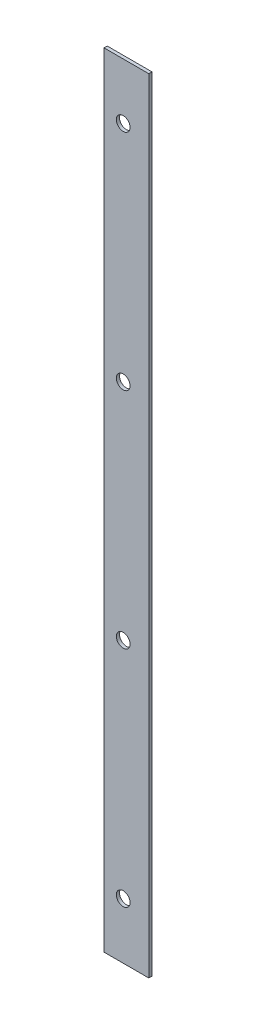
ISO-10303-21;
HEADER;
FILE_DESCRIPTION(('STEP AP214'),'2;1');
FILE_NAME('part.step','',(''),(''),'','','');
FILE_SCHEMA(('AUTOMOTIVE_DESIGN { 1 0 10303 214 1 1 1 1 }'));
ENDSEC;
DATA;
#1=APPLICATION_CONTEXT('core data for automotive mechanical design processes');
#2=APPLICATION_PROTOCOL_DEFINITION('international standard','automotive_design',2000,#1);
#3=PRODUCT_CONTEXT('',#1,'mechanical');
#4=PRODUCT('Part','Part','',(#3));
#5=PRODUCT_RELATED_PRODUCT_CATEGORY('part','',(#4));
#6=PRODUCT_DEFINITION_FORMATION('','',#4);
#7=PRODUCT_DEFINITION_CONTEXT('part definition',#1,'design');
#8=PRODUCT_DEFINITION('design','',#6,#7);
#9=PRODUCT_DEFINITION_SHAPE('','',#8);
#10=(LENGTH_UNIT() NAMED_UNIT(*) SI_UNIT(.MILLI.,.METRE.));
#11=(NAMED_UNIT(*) PLANE_ANGLE_UNIT() SI_UNIT($,.RADIAN.));
#12=(NAMED_UNIT(*) SI_UNIT($,.STERADIAN.) SOLID_ANGLE_UNIT());
#13=UNCERTAINTY_MEASURE_WITH_UNIT(LENGTH_MEASURE(1.E-05),#10,'distance_accuracy_value','');
#14=(GEOMETRIC_REPRESENTATION_CONTEXT(3) GLOBAL_UNCERTAINTY_ASSIGNED_CONTEXT((#13)) GLOBAL_UNIT_ASSIGNED_CONTEXT((#10,
#11,#12)) REPRESENTATION_CONTEXT('',''));
#15=CARTESIAN_POINT('',(0.,0.,0.));
#16=DIRECTION('',(0.,0.,1.));
#17=DIRECTION('',(1.,0.,0.));
#18=AXIS2_PLACEMENT_3D('',#15,#16,#17);
#19=CARTESIAN_POINT('',(-5.99999999999997,122.5,1.));
#20=DIRECTION('',(0.,0.,-1.));
#21=DIRECTION('',(-1.,0.,0.));
#22=AXIS2_PLACEMENT_3D('',#19,#20,#21);
#23=PLANE('',#22);
#24=CARTESIAN_POINT('',(0.,35.,1.));
#25=DIRECTION('',(0.,0.,1.));
#26=DIRECTION('',(1.,0.,0.));
#27=AXIS2_PLACEMENT_3D('',#24,#25,#26);
#28=CIRCLE('',#27,2.15);
#29=CARTESIAN_POINT('',(2.15000000000001,35.,1.));
#30=VERTEX_POINT('',#29);
#31=EDGE_CURVE('E119',#30,#30,#28,.T.);
#32=ORIENTED_EDGE('',*,*,#31,.F.);
#33=EDGE_LOOP('',(#32));
#34=FACE_BOUND('',#33,.T.);
#35=CARTESIAN_POINT('',(0.,-105.,1.));
#36=DIRECTION('',(0.,0.,1.));
#37=DIRECTION('',(1.,0.,0.));
#38=AXIS2_PLACEMENT_3D('',#35,#36,#37);
#39=CIRCLE('',#38,2.15);
#40=CARTESIAN_POINT('',(2.15000000000003,-105.,1.));
#41=VERTEX_POINT('',#40);
#42=EDGE_CURVE('E98',#41,#41,#39,.T.);
#43=ORIENTED_EDGE('',*,*,#42,.F.);
#44=EDGE_LOOP('',(#43));
#45=FACE_BOUND('',#44,.T.);
#46=DIRECTION('',(0.,-1.,0.));
#47=VECTOR('',#46,1.);
#48=CARTESIAN_POINT('',(-5.99999999999997,-122.5,1.));
#49=LINE('',#48,#47);
#50=CARTESIAN_POINT('',(-5.99999999999997,122.5,1.));
#51=VERTEX_POINT('',#50);
#52=CARTESIAN_POINT('',(-5.99999999999997,-122.5,1.));
#53=VERTEX_POINT('',#52);
#54=EDGE_CURVE('E83',#51,#53,#49,.T.);
#55=ORIENTED_EDGE('',*,*,#54,.T.);
#56=DIRECTION('',(1.,0.,0.));
#57=VECTOR('',#56,1.);
#58=CARTESIAN_POINT('',(-5.99999999999997,-122.5,1.));
#59=LINE('',#58,#57);
#60=CARTESIAN_POINT('',(8.00000000000003,-122.5,1.));
#61=VERTEX_POINT('',#60);
#62=EDGE_CURVE('E78',#53,#61,#59,.T.);
#63=ORIENTED_EDGE('',*,*,#62,.T.);
#64=DIRECTION('',(0.,1.,0.));
#65=VECTOR('',#64,1.);
#66=CARTESIAN_POINT('',(8.00000000000003,-122.5,1.));
#67=LINE('',#66,#65);
#68=CARTESIAN_POINT('',(8.00000000000003,122.5,1.));
#69=VERTEX_POINT('',#68);
#70=EDGE_CURVE('E81',#61,#69,#67,.T.);
#71=ORIENTED_EDGE('',*,*,#70,.T.);
#72=DIRECTION('',(-1.,0.,0.));
#73=VECTOR('',#72,1.);
#74=CARTESIAN_POINT('',(-5.99999999999997,122.5,1.));
#75=LINE('',#74,#73);
#76=EDGE_CURVE('E48',#69,#51,#75,.T.);
#77=ORIENTED_EDGE('',*,*,#76,.T.);
#78=EDGE_LOOP('',(#55,#63,#71,#77));
#79=FACE_BOUND('',#78,.T.);
#80=CARTESIAN_POINT('',(0.,-35.,1.));
#81=DIRECTION('',(0.,0.,1.));
#82=DIRECTION('',(1.,0.,0.));
#83=AXIS2_PLACEMENT_3D('',#80,#81,#82);
#84=CIRCLE('',#83,2.15);
#85=CARTESIAN_POINT('',(2.15000000000002,-35.,1.));
#86=VERTEX_POINT('',#85);
#87=EDGE_CURVE('E113',#86,#86,#84,.T.);
#88=ORIENTED_EDGE('',*,*,#87,.F.);
#89=EDGE_LOOP('',(#88));
#90=FACE_BOUND('',#89,.T.);
#91=CARTESIAN_POINT('',(0.,105.,1.));
#92=DIRECTION('',(0.,0.,1.));
#93=DIRECTION('',(1.,0.,0.));
#94=AXIS2_PLACEMENT_3D('',#91,#92,#93);
#95=CIRCLE('',#94,2.15);
#96=CARTESIAN_POINT('',(2.15,105.,1.));
#97=VERTEX_POINT('',#96);
#98=EDGE_CURVE('E125',#97,#97,#95,.T.);
#99=ORIENTED_EDGE('',*,*,#98,.F.);
#100=EDGE_LOOP('',(#99));
#101=FACE_BOUND('',#100,.T.);
#102=ADVANCED_FACE('F31',(#34,#45,#79,#90,#101),#23,.F.);
#103=CARTESIAN_POINT('',(-5.99999999999997,122.5,0.));
#104=DIRECTION('',(0.,0.,-1.));
#105=DIRECTION('',(-1.,0.,0.));
#106=AXIS2_PLACEMENT_3D('',#103,#104,#105);
#107=PLANE('',#106);
#108=CARTESIAN_POINT('',(0.,35.,0.));
#109=DIRECTION('',(0.,0.,1.));
#110=DIRECTION('',(1.,0.,0.));
#111=AXIS2_PLACEMENT_3D('',#108,#109,#110);
#112=CIRCLE('',#111,2.15);
#113=CARTESIAN_POINT('',(2.15000000000001,35.,0.));
#114=VERTEX_POINT('',#113);
#115=EDGE_CURVE('E122',#114,#114,#112,.T.);
#116=ORIENTED_EDGE('',*,*,#115,.T.);
#117=EDGE_LOOP('',(#116));
#118=FACE_BOUND('',#117,.T.);
#119=CARTESIAN_POINT('',(0.,-105.,0.));
#120=DIRECTION('',(0.,0.,1.));
#121=DIRECTION('',(1.,0.,0.));
#122=AXIS2_PLACEMENT_3D('',#119,#120,#121);
#123=CIRCLE('',#122,2.15);
#124=CARTESIAN_POINT('',(2.15000000000003,-105.,0.));
#125=VERTEX_POINT('',#124);
#126=EDGE_CURVE('E110',#125,#125,#123,.T.);
#127=ORIENTED_EDGE('',*,*,#126,.T.);
#128=EDGE_LOOP('',(#127));
#129=FACE_BOUND('',#128,.T.);
#130=DIRECTION('',(0.,-1.,0.));
#131=VECTOR('',#130,1.);
#132=CARTESIAN_POINT('',(-5.99999999999997,-122.5,0.));
#133=LINE('',#132,#131);
#134=CARTESIAN_POINT('',(-5.99999999999997,122.5,0.));
#135=VERTEX_POINT('',#134);
#136=CARTESIAN_POINT('',(-5.99999999999997,-122.5,0.));
#137=VERTEX_POINT('',#136);
#138=EDGE_CURVE('E95',#135,#137,#133,.T.);
#139=ORIENTED_EDGE('',*,*,#138,.F.);
#140=DIRECTION('',(-1.,0.,0.));
#141=VECTOR('',#140,1.);
#142=CARTESIAN_POINT('',(-5.99999999999997,122.5,0.));
#143=LINE('',#142,#141);
#144=CARTESIAN_POINT('',(8.00000000000003,122.5,0.));
#145=VERTEX_POINT('',#144);
#146=EDGE_CURVE('E71',#145,#135,#143,.T.);
#147=ORIENTED_EDGE('',*,*,#146,.F.);
#148=DIRECTION('',(0.,1.,0.));
#149=VECTOR('',#148,1.);
#150=CARTESIAN_POINT('',(8.00000000000003,-122.5,0.));
#151=LINE('',#150,#149);
#152=CARTESIAN_POINT('',(8.00000000000003,-122.5,0.));
#153=VERTEX_POINT('',#152);
#154=EDGE_CURVE('E65',#153,#145,#151,.T.);
#155=ORIENTED_EDGE('',*,*,#154,.F.);
#156=DIRECTION('',(1.,0.,0.));
#157=VECTOR('',#156,1.);
#158=CARTESIAN_POINT('',(-5.99999999999997,-122.5,0.));
#159=LINE('',#158,#157);
#160=EDGE_CURVE('E87',#137,#153,#159,.T.);
#161=ORIENTED_EDGE('',*,*,#160,.F.);
#162=EDGE_LOOP('',(#139,#147,#155,#161));
#163=FACE_BOUND('',#162,.T.);
#164=CARTESIAN_POINT('',(0.,-35.,0.));
#165=DIRECTION('',(0.,0.,1.));
#166=DIRECTION('',(1.,0.,0.));
#167=AXIS2_PLACEMENT_3D('',#164,#165,#166);
#168=CIRCLE('',#167,2.15);
#169=CARTESIAN_POINT('',(2.15000000000002,-35.,0.));
#170=VERTEX_POINT('',#169);
#171=EDGE_CURVE('E116',#170,#170,#168,.T.);
#172=ORIENTED_EDGE('',*,*,#171,.T.);
#173=EDGE_LOOP('',(#172));
#174=FACE_BOUND('',#173,.T.);
#175=CARTESIAN_POINT('',(0.,105.,0.));
#176=DIRECTION('',(0.,0.,1.));
#177=DIRECTION('',(1.,0.,0.));
#178=AXIS2_PLACEMENT_3D('',#175,#176,#177);
#179=CIRCLE('',#178,2.15);
#180=CARTESIAN_POINT('',(2.15,105.,0.));
#181=VERTEX_POINT('',#180);
#182=EDGE_CURVE('E128',#181,#181,#179,.T.);
#183=ORIENTED_EDGE('',*,*,#182,.T.);
#184=EDGE_LOOP('',(#183));
#185=FACE_BOUND('',#184,.T.);
#186=ADVANCED_FACE('F106',(#118,#129,#163,#174,#185),#107,.T.);
#187=CARTESIAN_POINT('',(-5.99999999999997,-122.5,1.));
#188=DIRECTION('',(1.,0.,0.));
#189=DIRECTION('',(0.,0.,-1.));
#190=AXIS2_PLACEMENT_3D('',#187,#188,#189);
#191=PLANE('',#190);
#192=ORIENTED_EDGE('',*,*,#138,.T.);
#193=DIRECTION('',(0.,0.,-1.));
#194=VECTOR('',#193,1.);
#195=CARTESIAN_POINT('',(-5.99999999999997,-122.5,1.));
#196=LINE('',#195,#194);
#197=EDGE_CURVE('E11',#53,#137,#196,.T.);
#198=ORIENTED_EDGE('',*,*,#197,.F.);
#199=ORIENTED_EDGE('',*,*,#54,.F.);
#200=DIRECTION('',(0.,0.,-1.));
#201=VECTOR('',#200,1.);
#202=CARTESIAN_POINT('',(-5.99999999999997,122.5,1.));
#203=LINE('',#202,#201);
#204=EDGE_CURVE('E91',#51,#135,#203,.T.);
#205=ORIENTED_EDGE('',*,*,#204,.T.);
#206=EDGE_LOOP('',(#192,#198,#199,#205));
#207=FACE_BOUND('',#206,.T.);
#208=ADVANCED_FACE('F33',(#207),#191,.F.);
#209=CARTESIAN_POINT('',(-5.99999999999997,-122.5,1.));
#210=DIRECTION('',(0.,1.,0.));
#211=DIRECTION('',(0.,0.,1.));
#212=AXIS2_PLACEMENT_3D('',#209,#210,#211);
#213=PLANE('',#212);
#214=ORIENTED_EDGE('',*,*,#160,.T.);
#215=DIRECTION('',(0.,0.,-1.));
#216=VECTOR('',#215,1.);
#217=CARTESIAN_POINT('',(8.00000000000003,-122.5,1.));
#218=LINE('',#217,#216);
#219=EDGE_CURVE('E40',#61,#153,#218,.T.);
#220=ORIENTED_EDGE('',*,*,#219,.F.);
#221=ORIENTED_EDGE('',*,*,#62,.F.);
#222=ORIENTED_EDGE('',*,*,#197,.T.);
#223=EDGE_LOOP('',(#214,#220,#221,#222));
#224=FACE_BOUND('',#223,.T.);
#225=ADVANCED_FACE('F86',(#224),#213,.F.);
#226=CARTESIAN_POINT('',(8.00000000000003,-122.5,1.));
#227=DIRECTION('',(-1.,0.,0.));
#228=DIRECTION('',(0.,0.,1.));
#229=AXIS2_PLACEMENT_3D('',#226,#227,#228);
#230=PLANE('',#229);
#231=ORIENTED_EDGE('',*,*,#154,.T.);
#232=DIRECTION('',(0.,0.,-1.));
#233=VECTOR('',#232,1.);
#234=CARTESIAN_POINT('',(8.00000000000003,122.5,1.));
#235=LINE('',#234,#233);
#236=EDGE_CURVE('E88',#69,#145,#235,.T.);
#237=ORIENTED_EDGE('',*,*,#236,.F.);
#238=ORIENTED_EDGE('',*,*,#70,.F.);
#239=ORIENTED_EDGE('',*,*,#219,.T.);
#240=EDGE_LOOP('',(#231,#237,#238,#239));
#241=FACE_BOUND('',#240,.T.);
#242=ADVANCED_FACE('F89',(#241),#230,.F.);
#243=CARTESIAN_POINT('',(-5.99999999999997,122.5,1.));
#244=DIRECTION('',(0.,-1.,0.));
#245=DIRECTION('',(0.,0.,-1.));
#246=AXIS2_PLACEMENT_3D('',#243,#244,#245);
#247=PLANE('',#246);
#248=ORIENTED_EDGE('',*,*,#146,.T.);
#249=ORIENTED_EDGE('',*,*,#204,.F.);
#250=ORIENTED_EDGE('',*,*,#76,.F.);
#251=ORIENTED_EDGE('',*,*,#236,.T.);
#252=EDGE_LOOP('',(#248,#249,#250,#251));
#253=FACE_BOUND('',#252,.T.);
#254=ADVANCED_FACE('F103',(#253),#247,.F.);
#255=CARTESIAN_POINT('',(0.,-105.,1.));
#256=DIRECTION('',(0.,0.,-1.));
#257=DIRECTION('',(-1.,0.,0.));
#258=AXIS2_PLACEMENT_3D('',#255,#256,#257);
#259=CYLINDRICAL_SURFACE('',#258,2.15);
#260=ORIENTED_EDGE('',*,*,#42,.T.);
#261=EDGE_LOOP('',(#260));
#262=FACE_BOUND('',#261,.T.);
#263=ORIENTED_EDGE('',*,*,#126,.F.);
#264=EDGE_LOOP('',(#263));
#265=FACE_BOUND('',#264,.T.);
#266=ADVANCED_FACE('F148',(#262,#265),#259,.F.);
#267=CARTESIAN_POINT('',(0.,-35.,1.));
#268=DIRECTION('',(0.,0.,-1.));
#269=DIRECTION('',(-1.,0.,0.));
#270=AXIS2_PLACEMENT_3D('',#267,#268,#269);
#271=CYLINDRICAL_SURFACE('',#270,2.15);
#272=ORIENTED_EDGE('',*,*,#87,.T.);
#273=EDGE_LOOP('',(#272));
#274=FACE_BOUND('',#273,.T.);
#275=ORIENTED_EDGE('',*,*,#171,.F.);
#276=EDGE_LOOP('',(#275));
#277=FACE_BOUND('',#276,.T.);
#278=ADVANCED_FACE('F194',(#274,#277),#271,.F.);
#279=CARTESIAN_POINT('',(0.,35.,1.));
#280=DIRECTION('',(0.,0.,-1.));
#281=DIRECTION('',(-1.,0.,0.));
#282=AXIS2_PLACEMENT_3D('',#279,#280,#281);
#283=CYLINDRICAL_SURFACE('',#282,2.15);
#284=ORIENTED_EDGE('',*,*,#31,.T.);
#285=EDGE_LOOP('',(#284));
#286=FACE_BOUND('',#285,.T.);
#287=ORIENTED_EDGE('',*,*,#115,.F.);
#288=EDGE_LOOP('',(#287));
#289=FACE_BOUND('',#288,.T.);
#290=ADVANCED_FACE('F202',(#286,#289),#283,.F.);
#291=CARTESIAN_POINT('',(0.,105.,1.));
#292=DIRECTION('',(0.,0.,-1.));
#293=DIRECTION('',(-1.,0.,0.));
#294=AXIS2_PLACEMENT_3D('',#291,#292,#293);
#295=CYLINDRICAL_SURFACE('',#294,2.15);
#296=ORIENTED_EDGE('',*,*,#98,.T.);
#297=EDGE_LOOP('',(#296));
#298=FACE_BOUND('',#297,.T.);
#299=ORIENTED_EDGE('',*,*,#182,.F.);
#300=EDGE_LOOP('',(#299));
#301=FACE_BOUND('',#300,.T.);
#302=ADVANCED_FACE('F134',(#298,#301),#295,.F.);
#303=CLOSED_SHELL('',(#102,#186,#208,#225,#242,#254,#266,#278,#290,#302));
#304=MANIFOLD_SOLID_BREP('B2',#303);
#305=ADVANCED_BREP_SHAPE_REPRESENTATION('',(#18,#304),#14);
#306=SHAPE_DEFINITION_REPRESENTATION(#9,#305);
ENDSEC;
END-ISO-10303-21;
